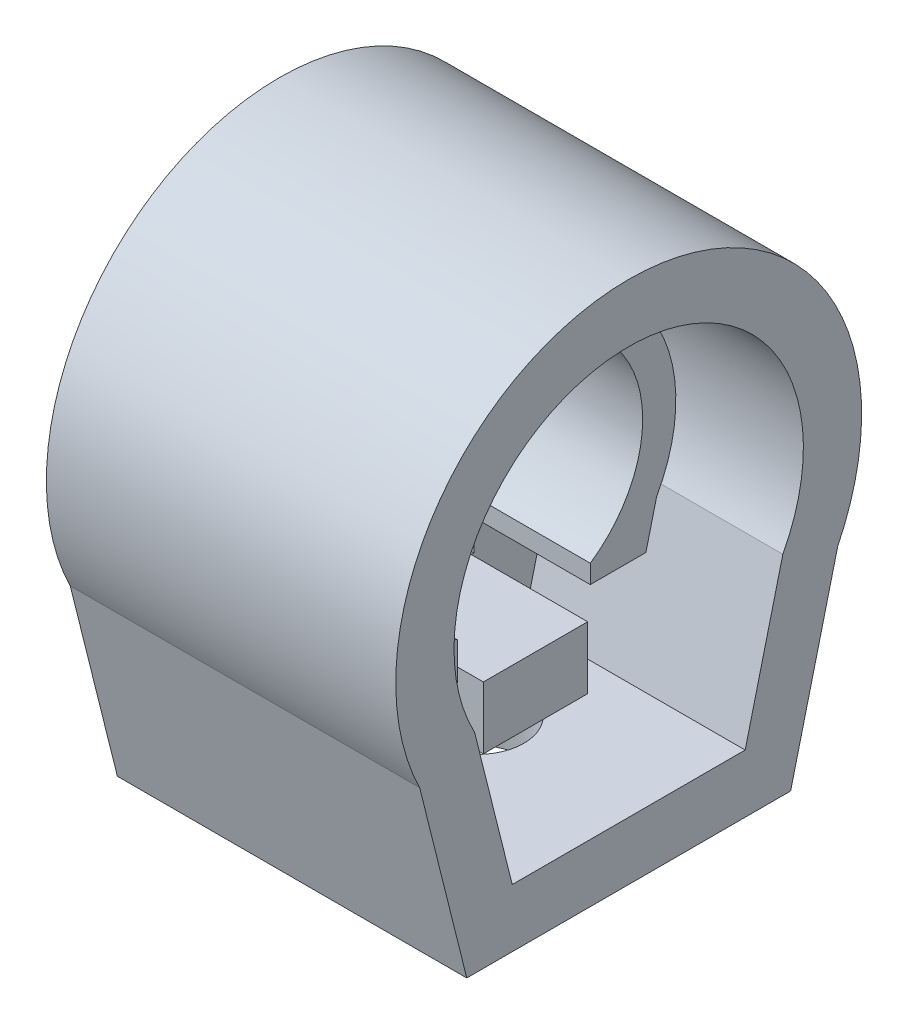
ISO-10303-21;
HEADER;
FILE_DESCRIPTION(('STEP AP214'),'2;1');
FILE_NAME('part.step','',(''),(''),'','','');
FILE_SCHEMA(('AUTOMOTIVE_DESIGN { 1 0 10303 214 1 1 1 1 }'));
ENDSEC;
DATA;
#1=APPLICATION_CONTEXT('core data for automotive mechanical design processes');
#2=APPLICATION_PROTOCOL_DEFINITION('international standard','automotive_design',2000,#1);
#3=PRODUCT_CONTEXT('',#1,'mechanical');
#4=PRODUCT('Part','Part','',(#3));
#5=PRODUCT_RELATED_PRODUCT_CATEGORY('part','',(#4));
#6=PRODUCT_DEFINITION_FORMATION('','',#4);
#7=PRODUCT_DEFINITION_CONTEXT('part definition',#1,'design');
#8=PRODUCT_DEFINITION('design','',#6,#7);
#9=PRODUCT_DEFINITION_SHAPE('','',#8);
#10=(LENGTH_UNIT() NAMED_UNIT(*) SI_UNIT(.MILLI.,.METRE.));
#11=(NAMED_UNIT(*) PLANE_ANGLE_UNIT() SI_UNIT($,.RADIAN.));
#12=(NAMED_UNIT(*) SI_UNIT($,.STERADIAN.) SOLID_ANGLE_UNIT());
#13=UNCERTAINTY_MEASURE_WITH_UNIT(LENGTH_MEASURE(1.E-05),#10,'distance_accuracy_value','');
#14=(GEOMETRIC_REPRESENTATION_CONTEXT(3) GLOBAL_UNCERTAINTY_ASSIGNED_CONTEXT((#13)) GLOBAL_UNIT_ASSIGNED_CONTEXT((#10,
#11,#12)) REPRESENTATION_CONTEXT('',''));
#15=CARTESIAN_POINT('',(0.,0.,0.));
#16=DIRECTION('',(0.,0.,1.));
#17=DIRECTION('',(1.,0.,0.));
#18=AXIS2_PLACEMENT_3D('',#15,#16,#17);
#19=CARTESIAN_POINT('',(53.5779066239683,32.7,20.7));
#20=DIRECTION('',(0.,1.,0.));
#21=DIRECTION('',(0.,0.,1.));
#22=AXIS2_PLACEMENT_3D('',#19,#20,#21);
#23=PLANE('',#22);
#24=DIRECTION('',(0.,0.,1.));
#25=VECTOR('',#24,1.);
#26=CARTESIAN_POINT('',(11.,32.7,15.));
#27=LINE('',#26,#25);
#28=CARTESIAN_POINT('',(11.,32.7,9.3));
#29=VERTEX_POINT('',#28);
#30=CARTESIAN_POINT('',(11.,32.7,20.7));
#31=VERTEX_POINT('',#30);
#32=EDGE_CURVE('E434',#29,#31,#27,.T.);
#33=ORIENTED_EDGE('',*,*,#32,.T.);
#34=DIRECTION('',(-1.,0.,0.));
#35=VECTOR('',#34,1.);
#36=CARTESIAN_POINT('',(53.5779066239683,32.7,20.7));
#37=LINE('',#36,#35);
#38=CARTESIAN_POINT('',(0.,32.7,20.7));
#39=VERTEX_POINT('',#38);
#40=EDGE_CURVE('E368',#31,#39,#37,.T.);
#41=ORIENTED_EDGE('',*,*,#40,.T.);
#42=DIRECTION('',(0.,0.,-1.));
#43=VECTOR('',#42,1.);
#44=CARTESIAN_POINT('',(0.,32.7,20.7));
#45=LINE('',#44,#43);
#46=CARTESIAN_POINT('',(0.,32.7,9.3));
#47=VERTEX_POINT('',#46);
#48=EDGE_CURVE('E357',#39,#47,#45,.T.);
#49=ORIENTED_EDGE('',*,*,#48,.T.);
#50=DIRECTION('',(-1.,0.,0.));
#51=VECTOR('',#50,1.);
#52=CARTESIAN_POINT('',(53.5779066239683,32.7,9.3));
#53=LINE('',#52,#51);
#54=EDGE_CURVE('E336',#29,#47,#53,.T.);
#55=ORIENTED_EDGE('',*,*,#54,.F.);
#56=EDGE_LOOP('',(#33,#41,#49,#55));
#57=FACE_BOUND('',#56,.T.);
#58=ADVANCED_FACE('F39',(#57),#23,.F.);
#59=CARTESIAN_POINT('',(21.,20.,15.));
#60=DIRECTION('',(1.,0.,0.));
#61=DIRECTION('',(0.,0.,-1.));
#62=AXIS2_PLACEMENT_3D('',#59,#60,#61);
#63=PLANE('',#62);
#64=DIRECTION('',(0.,-1.,0.));
#65=VECTOR('',#64,1.);
#66=CARTESIAN_POINT('',(21.,32.7,9.3));
#67=LINE('',#66,#65);
#68=CARTESIAN_POINT('',(21.,31.7393568818739,9.3));
#69=VERTEX_POINT('',#68);
#70=CARTESIAN_POINT('',(21.,28.458723307923,9.3));
#71=VERTEX_POINT('',#70);
#72=EDGE_CURVE('E395',#69,#71,#67,.T.);
#73=ORIENTED_EDGE('',*,*,#72,.T.);
#74=CARTESIAN_POINT('',(21.,20.,15.));
#75=DIRECTION('',(1.,0.,0.));
#76=DIRECTION('',(0.,0.,-1.));
#77=AXIS2_PLACEMENT_3D('',#74,#75,#76);
#78=CIRCLE('',#77,10.2);
#79=CARTESIAN_POINT('',(21.,11.541276692077,9.3));
#80=VERTEX_POINT('',#79);
#81=EDGE_CURVE('E390',#71,#80,#78,.F.);
#82=ORIENTED_EDGE('',*,*,#81,.T.);
#83=DIRECTION('',(0.,-1.,0.));
#84=VECTOR('',#83,1.);
#85=CARTESIAN_POINT('',(21.,7.3,9.3));
#86=LINE('',#85,#84);
#87=CARTESIAN_POINT('',(21.,9.95,9.3));
#88=VERTEX_POINT('',#87);
#89=EDGE_CURVE('E385',#80,#88,#86,.T.);
#90=ORIENTED_EDGE('',*,*,#89,.T.);
#91=DIRECTION('',(0.,0.,1.));
#92=VECTOR('',#91,1.);
#93=CARTESIAN_POINT('',(21.,9.95,9.52251399248861));
#94=LINE('',#93,#92);
#95=CARTESIAN_POINT('',(21.,9.95,4.52251399248861));
#96=VERTEX_POINT('',#95);
#97=EDGE_CURVE('E455',#96,#88,#94,.T.);
#98=ORIENTED_EDGE('',*,*,#97,.F.);
#99=DIRECTION('',(0.,0.970142500145332,-0.242535625036333));
#100=VECTOR('',#99,1.);
#101=CARTESIAN_POINT('',(21.,1.95000000000001,6.5225139924886));
#102=LINE('',#101,#100);
#103=CARTESIAN_POINT('',(21.,13.6552461306368,3.5962024598294));
#104=VERTEX_POINT('',#103);
#105=EDGE_CURVE('E518',#96,#104,#102,.T.);
#106=ORIENTED_EDGE('',*,*,#105,.T.);
#107=CARTESIAN_POINT('',(21.,20.,15.));
#108=DIRECTION('',(1.,0.,0.));
#109=DIRECTION('',(0.,0.,-1.));
#110=AXIS2_PLACEMENT_3D('',#107,#108,#109);
#111=CIRCLE('',#110,13.05);
#112=EDGE_CURVE('E522',#104,#69,#111,.T.);
#113=ORIENTED_EDGE('',*,*,#112,.T.);
#114=EDGE_LOOP('',(#73,#82,#90,#98,#106,#113));
#115=FACE_BOUND('',#114,.T.);
#116=ADVANCED_FACE('F608',(#115),#63,.T.);
#117=DIRECTION('',(0.,0.,1.));
#118=VECTOR('',#117,1.);
#119=CARTESIAN_POINT('',(21.,7.3,20.7));
#120=LINE('',#119,#118);
#121=CARTESIAN_POINT('',(21.,7.3,9.52251399248861));
#122=VERTEX_POINT('',#121);
#123=CARTESIAN_POINT('',(21.,7.3,18.4774860075114));
#124=VERTEX_POINT('',#123);
#125=EDGE_CURVE('E380',#122,#124,#120,.T.);
#126=ORIENTED_EDGE('',*,*,#125,.T.);
#127=DIRECTION('',(0.,1.,0.));
#128=VECTOR('',#127,1.);
#129=CARTESIAN_POINT('',(21.,6.94522765648909,18.4774860075114));
#130=LINE('',#129,#128);
#131=CARTESIAN_POINT('',(21.,1.95,18.4774860075114));
#132=VERTEX_POINT('',#131);
#133=EDGE_CURVE('E491',#132,#124,#130,.T.);
#134=ORIENTED_EDGE('',*,*,#133,.F.);
#135=DIRECTION('',(0.,0.,-1.));
#136=VECTOR('',#135,1.);
#137=CARTESIAN_POINT('',(21.,1.95000000000001,23.4774860075114));
#138=LINE('',#137,#136);
#139=CARTESIAN_POINT('',(21.,1.95,9.52251399248862));
#140=VERTEX_POINT('',#139);
#141=EDGE_CURVE('E513',#132,#140,#138,.T.);
#142=ORIENTED_EDGE('',*,*,#141,.T.);
#143=DIRECTION('',(0.,-1.,0.));
#144=VECTOR('',#143,1.);
#145=CARTESIAN_POINT('',(21.,1.95,9.52251399248862));
#146=LINE('',#145,#144);
#147=EDGE_CURVE('E451',#122,#140,#146,.T.);
#148=ORIENTED_EDGE('',*,*,#147,.F.);
#149=EDGE_LOOP('',(#126,#134,#142,#148));
#150=FACE_BOUND('',#149,.T.);
#151=ADVANCED_FACE('F632',(#150),#63,.T.);
#152=CARTESIAN_POINT('',(21.,20.,15.));
#153=DIRECTION('',(-1.,0.,0.));
#154=DIRECTION('',(0.,0.,1.));
#155=AXIS2_PLACEMENT_3D('',#152,#153,#154);
#156=CYLINDRICAL_SURFACE('',#155,13.05);
#157=CARTESIAN_POINT('',(11.,20.,15.));
#158=DIRECTION('',(1.,0.,0.));
#159=DIRECTION('',(0.,0.,-1.));
#160=AXIS2_PLACEMENT_3D('',#157,#158,#159);
#161=CIRCLE('',#160,13.05);
#162=CARTESIAN_POINT('',(11.,13.6552461306368,3.5962024598294));
#163=VERTEX_POINT('',#162);
#164=CARTESIAN_POINT('',(11.,31.7393568818739,9.3));
#165=VERTEX_POINT('',#164);
#166=EDGE_CURVE('E514',#163,#165,#161,.T.);
#167=ORIENTED_EDGE('',*,*,#166,.T.);
#168=DIRECTION('',(-1.,0.,0.));
#169=VECTOR('',#168,1.);
#170=CARTESIAN_POINT('',(21.,31.7393568818739,9.3));
#171=LINE('',#170,#169);
#172=EDGE_CURVE('E11',#165,#69,#171,.F.);
#173=ORIENTED_EDGE('',*,*,#172,.T.);
#174=ORIENTED_EDGE('',*,*,#112,.F.);
#175=DIRECTION('',(-1.,0.,0.));
#176=VECTOR('',#175,1.);
#177=CARTESIAN_POINT('',(21.,13.6552461306368,3.5962024598294));
#178=LINE('',#177,#176);
#179=EDGE_CURVE('E544',#104,#163,#178,.T.);
#180=ORIENTED_EDGE('',*,*,#179,.T.);
#181=EDGE_LOOP('',(#167,#173,#174,#180));
#182=FACE_BOUND('',#181,.T.);
#183=ADVANCED_FACE('F644',(#182),#156,.T.);
#184=CARTESIAN_POINT('',(11.,20.,15.));
#185=DIRECTION('',(1.,0.,0.));
#186=DIRECTION('',(0.,0.,-1.));
#187=AXIS2_PLACEMENT_3D('',#184,#185,#186);
#188=PLANE('',#187);
#189=ORIENTED_EDGE('',*,*,#32,.F.);
#190=DIRECTION('',(0.,1.,0.));
#191=VECTOR('',#190,1.);
#192=CARTESIAN_POINT('',(11.,20.,9.3));
#193=LINE('',#192,#191);
#194=EDGE_CURVE('E431',#165,#29,#193,.T.);
#195=ORIENTED_EDGE('',*,*,#194,.F.);
#196=ORIENTED_EDGE('',*,*,#166,.F.);
#197=DIRECTION('',(0.,0.970142500145332,-0.242535625036333));
#198=VECTOR('',#197,1.);
#199=CARTESIAN_POINT('',(11.,1.95000000000001,6.5225139924886));
#200=LINE('',#199,#198);
#201=CARTESIAN_POINT('',(11.,9.95,4.52251399248861));
#202=VERTEX_POINT('',#201);
#203=EDGE_CURVE('E534',#202,#163,#200,.T.);
#204=ORIENTED_EDGE('',*,*,#203,.F.);
#205=DIRECTION('',(0.,0.,1.));
#206=VECTOR('',#205,1.);
#207=CARTESIAN_POINT('',(11.,9.95,9.52251399248861));
#208=LINE('',#207,#206);
#209=CARTESIAN_POINT('',(11.,9.95,9.3));
#210=VERTEX_POINT('',#209);
#211=EDGE_CURVE('E446',#202,#210,#208,.T.);
#212=ORIENTED_EDGE('',*,*,#211,.T.);
#213=DIRECTION('',(0.,1.,0.));
#214=VECTOR('',#213,1.);
#215=CARTESIAN_POINT('',(11.,20.,9.3));
#216=LINE('',#215,#214);
#217=CARTESIAN_POINT('',(11.,7.3,9.3));
#218=VERTEX_POINT('',#217);
#219=EDGE_CURVE('E425',#218,#210,#216,.T.);
#220=ORIENTED_EDGE('',*,*,#219,.F.);
#221=DIRECTION('',(0.,0.,-1.));
#222=VECTOR('',#221,1.);
#223=CARTESIAN_POINT('',(11.,7.3,15.));
#224=LINE('',#223,#222);
#225=CARTESIAN_POINT('',(11.,7.3,9.52251399248861));
#226=VERTEX_POINT('',#225);
#227=EDGE_CURVE('E418',#226,#218,#224,.T.);
#228=ORIENTED_EDGE('',*,*,#227,.F.);
#229=DIRECTION('',(0.,-1.,0.));
#230=VECTOR('',#229,1.);
#231=CARTESIAN_POINT('',(11.,1.95,9.52251399248862));
#232=LINE('',#231,#230);
#233=CARTESIAN_POINT('',(11.,1.95,9.52251399248862));
#234=VERTEX_POINT('',#233);
#235=EDGE_CURVE('E450',#226,#234,#232,.T.);
#236=ORIENTED_EDGE('',*,*,#235,.T.);
#237=DIRECTION('',(0.,0.,-1.));
#238=VECTOR('',#237,1.);
#239=CARTESIAN_POINT('',(11.,1.95000000000001,23.4774860075114));
#240=LINE('',#239,#238);
#241=CARTESIAN_POINT('',(11.,1.95,18.4774860075114));
#242=VERTEX_POINT('',#241);
#243=EDGE_CURVE('E530',#242,#234,#240,.T.);
#244=ORIENTED_EDGE('',*,*,#243,.F.);
#245=DIRECTION('',(0.,1.,0.));
#246=VECTOR('',#245,1.);
#247=CARTESIAN_POINT('',(11.,1.95,18.4774860075114));
#248=LINE('',#247,#246);
#249=CARTESIAN_POINT('',(11.,7.3,18.4774860075114));
#250=VERTEX_POINT('',#249);
#251=EDGE_CURVE('E477',#242,#250,#248,.T.);
#252=ORIENTED_EDGE('',*,*,#251,.T.);
#253=CARTESIAN_POINT('',(11.,7.3,20.7));
#254=VERTEX_POINT('',#253);
#255=EDGE_CURVE('E63',#254,#250,#224,.T.);
#256=ORIENTED_EDGE('',*,*,#255,.F.);
#257=DIRECTION('',(0.,-1.,0.));
#258=VECTOR('',#257,1.);
#259=CARTESIAN_POINT('',(11.,20.,20.7));
#260=LINE('',#259,#258);
#261=CARTESIAN_POINT('',(11.,8.31625060179738,20.7));
#262=VERTEX_POINT('',#261);
#263=EDGE_CURVE('E422',#262,#254,#260,.T.);
#264=ORIENTED_EDGE('',*,*,#263,.F.);
#265=CARTESIAN_POINT('',(11.,20.,15.));
#266=DIRECTION('',(-1.,0.,0.));
#267=DIRECTION('',(0.,0.,-1.));
#268=AXIS2_PLACEMENT_3D('',#265,#266,#267);
#269=CIRCLE('',#268,13.);
#270=CARTESIAN_POINT('',(11.,10.1302766431731,23.4610023554958));
#271=VERTEX_POINT('',#270);
#272=EDGE_CURVE('E481',#262,#271,#269,.T.);
#273=ORIENTED_EDGE('',*,*,#272,.T.);
#274=DIRECTION('',(0.,-0.970142500145331,-0.242535625036338));
#275=VECTOR('',#274,1.);
#276=CARTESIAN_POINT('',(11.,9.2545548925994,23.2420719178524));
#277=LINE('',#276,#275);
#278=CARTESIAN_POINT('',(11.,3.95,21.9159331947026));
#279=VERTEX_POINT('',#278);
#280=EDGE_CURVE('E469',#271,#279,#277,.T.);
#281=ORIENTED_EDGE('',*,*,#280,.T.);
#282=DIRECTION('',(0.,0.,1.));
#283=VECTOR('',#282,1.);
#284=CARTESIAN_POINT('',(11.,3.95,21.9159331947026));
#285=LINE('',#284,#283);
#286=CARTESIAN_POINT('',(11.,3.95,23.9774860075114));
#287=VERTEX_POINT('',#286);
#288=EDGE_CURVE('E472',#279,#287,#285,.T.);
#289=ORIENTED_EDGE('',*,*,#288,.T.);
#290=DIRECTION('',(0.,-0.970142500145332,-0.242535625036334));
#291=VECTOR('',#290,1.);
#292=CARTESIAN_POINT('',(11.,13.6552461306369,26.4037975401706));
#293=LINE('',#292,#291);
#294=CARTESIAN_POINT('',(11.,13.6552461306369,26.4037975401706));
#295=VERTEX_POINT('',#294);
#296=EDGE_CURVE('E466',#295,#287,#293,.T.);
#297=ORIENTED_EDGE('',*,*,#296,.F.);
#298=CARTESIAN_POINT('',(11.,31.7393568818739,20.7));
#299=VERTEX_POINT('',#298);
#300=EDGE_CURVE('E537',#299,#295,#161,.T.);
#301=ORIENTED_EDGE('',*,*,#300,.F.);
#302=DIRECTION('',(0.,-1.,0.));
#303=VECTOR('',#302,1.);
#304=CARTESIAN_POINT('',(11.,20.,20.7));
#305=LINE('',#304,#303);
#306=EDGE_CURVE('E428',#31,#299,#305,.T.);
#307=ORIENTED_EDGE('',*,*,#306,.F.);
#308=EDGE_LOOP('',(#189,#195,#196,#204,#212,#220,#228,#236,#244,#252,#256,#264,#273,#281,#289,
#297,#301,#307));
#309=FACE_BOUND('',#308,.T.);
#310=DIRECTION('',(0.,0.,-1.));
#311=VECTOR('',#310,1.);
#312=CARTESIAN_POINT('',(11.,0.,24.2192235935956));
#313=LINE('',#312,#311);
#314=CARTESIAN_POINT('',(11.,0.,25.));
#315=VERTEX_POINT('',#314);
#316=CARTESIAN_POINT('',(11.,0.,4.99999999999999));
#317=VERTEX_POINT('',#316);
#318=EDGE_CURVE('E548',#315,#317,#313,.T.);
#319=ORIENTED_EDGE('',*,*,#318,.T.);
#320=DIRECTION('',(0.,0.970142500145332,-0.242535625036333));
#321=VECTOR('',#320,1.);
#322=CARTESIAN_POINT('',(11.,0.757464374963679,4.81063390625908));
#323=LINE('',#322,#321);
#324=CARTESIAN_POINT('',(11.,12.9411764705883,1.76470588235293));
#325=VERTEX_POINT('',#324);
#326=EDGE_CURVE('E247',#317,#325,#323,.T.);
#327=ORIENTED_EDGE('',*,*,#326,.T.);
#328=CARTESIAN_POINT('',(11.,20.,15.));
#329=DIRECTION('',(1.,0.,0.));
#330=DIRECTION('',(0.,0.,-1.));
#331=AXIS2_PLACEMENT_3D('',#328,#329,#330);
#332=CIRCLE('',#331,15.);
#333=CARTESIAN_POINT('',(11.,12.9411764705883,28.2352941176471));
#334=VERTEX_POINT('',#333);
#335=EDGE_CURVE('E553',#325,#334,#332,.T.);
#336=ORIENTED_EDGE('',*,*,#335,.T.);
#337=DIRECTION('',(0.,-0.970142500145332,-0.242535625036334));
#338=VECTOR('',#337,1.);
#339=CARTESIAN_POINT('',(11.,12.9411764705883,28.2352941176471));
#340=LINE('',#339,#338);
#341=EDGE_CURVE('E557',#334,#315,#340,.T.);
#342=ORIENTED_EDGE('',*,*,#341,.T.);
#343=EDGE_LOOP('',(#319,#327,#336,#342));
#344=FACE_BOUND('',#343,.T.);
#345=ADVANCED_FACE('F583',(#309,#344),#188,.T.);
#346=CARTESIAN_POINT('',(0.,20.,15.));
#347=DIRECTION('',(1.,0.,0.));
#348=DIRECTION('',(0.,0.,-1.));
#349=AXIS2_PLACEMENT_3D('',#346,#347,#348);
#350=PLANE('',#349);
#351=DIRECTION('',(0.,-1.,0.));
#352=VECTOR('',#351,1.);
#353=CARTESIAN_POINT('',(0.,32.7,9.3));
#354=LINE('',#353,#352);
#355=CARTESIAN_POINT('',(0.,28.458723307923,9.3));
#356=VERTEX_POINT('',#355);
#357=EDGE_CURVE('E353',#47,#356,#354,.T.);
#358=ORIENTED_EDGE('',*,*,#357,.F.);
#359=ORIENTED_EDGE('',*,*,#48,.F.);
#360=DIRECTION('',(0.,1.,0.));
#361=VECTOR('',#360,1.);
#362=CARTESIAN_POINT('',(0.,32.7,20.7));
#363=LINE('',#362,#361);
#364=CARTESIAN_POINT('',(0.,28.458723307923,20.7));
#365=VERTEX_POINT('',#364);
#366=EDGE_CURVE('E325',#365,#39,#363,.T.);
#367=ORIENTED_EDGE('',*,*,#366,.F.);
#368=CARTESIAN_POINT('',(0.,20.,15.));
#369=DIRECTION('',(-1.,0.,0.));
#370=DIRECTION('',(0.,0.,1.));
#371=AXIS2_PLACEMENT_3D('',#368,#369,#370);
#372=CIRCLE('',#371,10.2);
#373=CARTESIAN_POINT('',(0.,11.541276692077,20.7));
#374=VERTEX_POINT('',#373);
#375=EDGE_CURVE('E55',#374,#365,#372,.T.);
#376=ORIENTED_EDGE('',*,*,#375,.F.);
#377=DIRECTION('',(0.,1.,0.));
#378=VECTOR('',#377,1.);
#379=CARTESIAN_POINT('',(0.,7.3,20.7));
#380=LINE('',#379,#378);
#381=CARTESIAN_POINT('',(0.,7.3,20.7));
#382=VERTEX_POINT('',#381);
#383=EDGE_CURVE('E337',#382,#374,#380,.T.);
#384=ORIENTED_EDGE('',*,*,#383,.F.);
#385=DIRECTION('',(0.,0.,1.));
#386=VECTOR('',#385,1.);
#387=CARTESIAN_POINT('',(0.,7.3,20.7));
#388=LINE('',#387,#386);
#389=CARTESIAN_POINT('',(0.,7.3,9.3));
#390=VERTEX_POINT('',#389);
#391=EDGE_CURVE('E341',#390,#382,#388,.T.);
#392=ORIENTED_EDGE('',*,*,#391,.F.);
#393=DIRECTION('',(0.,-1.,0.));
#394=VECTOR('',#393,1.);
#395=CARTESIAN_POINT('',(0.,7.3,9.3));
#396=LINE('',#395,#394);
#397=CARTESIAN_POINT('',(0.,11.541276692077,9.3));
#398=VERTEX_POINT('',#397);
#399=EDGE_CURVE('E345',#398,#390,#396,.T.);
#400=ORIENTED_EDGE('',*,*,#399,.F.);
#401=CARTESIAN_POINT('',(0.,20.,15.));
#402=DIRECTION('',(-1.,0.,0.));
#403=DIRECTION('',(0.,0.,1.));
#404=AXIS2_PLACEMENT_3D('',#401,#402,#403);
#405=CIRCLE('',#404,10.2);
#406=EDGE_CURVE('E349',#356,#398,#405,.T.);
#407=ORIENTED_EDGE('',*,*,#406,.F.);
#408=EDGE_LOOP('',(#358,#359,#367,#376,#384,#392,#400,#407));
#409=FACE_BOUND('',#408,.T.);
#410=DIRECTION('',(0.,-0.970142500145332,0.242535625036333));
#411=VECTOR('',#410,1.);
#412=CARTESIAN_POINT('',(0.,11.1747833848056,-2.94757787822349));
#413=LINE('',#412,#411);
#414=CARTESIAN_POINT('',(0.,11.1747833848056,-2.94757787822348));
#415=VERTEX_POINT('',#414);
#416=CARTESIAN_POINT('',(0.,-4.99999999999999,1.09611796797791));
#417=VERTEX_POINT('',#416);
#418=EDGE_CURVE('E283',#415,#417,#413,.T.);
#419=ORIENTED_EDGE('',*,*,#418,.T.);
#420=DIRECTION('',(0.,0.,1.));
#421=VECTOR('',#420,1.);
#422=CARTESIAN_POINT('',(0.,-4.99999999999999,1.09611796797791));
#423=LINE('',#422,#421);
#424=CARTESIAN_POINT('',(0.,-4.99999999999999,28.9038820320221));
#425=VERTEX_POINT('',#424);
#426=EDGE_CURVE('E311',#417,#425,#423,.T.);
#427=ORIENTED_EDGE('',*,*,#426,.T.);
#428=DIRECTION('',(0.,0.970142500145332,0.242535625036334));
#429=VECTOR('',#428,1.);
#430=CARTESIAN_POINT('',(0.,-4.99999999999999,28.9038820320221));
#431=LINE('',#430,#429);
#432=CARTESIAN_POINT('',(0.,11.1747833848057,32.9475778782235));
#433=VERTEX_POINT('',#432);
#434=EDGE_CURVE('E315',#425,#433,#431,.T.);
#435=ORIENTED_EDGE('',*,*,#434,.T.);
#436=CARTESIAN_POINT('',(0.,20.,15.));
#437=DIRECTION('',(-1.,0.,0.));
#438=DIRECTION('',(0.,0.,1.));
#439=AXIS2_PLACEMENT_3D('',#436,#437,#438);
#440=CIRCLE('',#439,20.);
#441=EDGE_CURVE('E295',#433,#415,#440,.T.);
#442=ORIENTED_EDGE('',*,*,#441,.T.);
#443=EDGE_LOOP('',(#419,#427,#435,#442));
#444=FACE_BOUND('',#443,.T.);
#445=ADVANCED_FACE('F41',(#409,#444),#350,.F.);
#446=DIRECTION('',(0.,1.,0.));
#447=VECTOR('',#446,1.);
#448=CARTESIAN_POINT('',(21.,7.3,20.7));
#449=LINE('',#448,#447);
#450=CARTESIAN_POINT('',(21.,8.31625060179738,20.7));
#451=VERTEX_POINT('',#450);
#452=CARTESIAN_POINT('',(21.,11.541276692077,20.7));
#453=VERTEX_POINT('',#452);
#454=EDGE_CURVE('E375',#451,#453,#449,.T.);
#455=ORIENTED_EDGE('',*,*,#454,.T.);
#456=CARTESIAN_POINT('',(21.,20.,15.));
#457=DIRECTION('',(1.,0.,0.));
#458=DIRECTION('',(0.,0.,-1.));
#459=AXIS2_PLACEMENT_3D('',#456,#457,#458);
#460=CIRCLE('',#459,10.2);
#461=CARTESIAN_POINT('',(21.,28.458723307923,20.7));
#462=VERTEX_POINT('',#461);
#463=EDGE_CURVE('E370',#453,#462,#460,.F.);
#464=ORIENTED_EDGE('',*,*,#463,.T.);
#465=DIRECTION('',(0.,1.,0.));
#466=VECTOR('',#465,1.);
#467=CARTESIAN_POINT('',(21.,32.7,20.7));
#468=LINE('',#467,#466);
#469=CARTESIAN_POINT('',(21.,31.7393568818739,20.7));
#470=VERTEX_POINT('',#469);
#471=EDGE_CURVE('E364',#462,#470,#468,.T.);
#472=ORIENTED_EDGE('',*,*,#471,.T.);
#473=CARTESIAN_POINT('',(21.,13.6552461306369,26.4037975401706));
#474=VERTEX_POINT('',#473);
#475=EDGE_CURVE('E521',#470,#474,#111,.T.);
#476=ORIENTED_EDGE('',*,*,#475,.T.);
#477=DIRECTION('',(0.,-0.970142500145332,-0.242535625036334));
#478=VECTOR('',#477,1.);
#479=CARTESIAN_POINT('',(21.,13.6552461306369,26.4037975401706));
#480=LINE('',#479,#478);
#481=CARTESIAN_POINT('',(21.,3.95,23.9774860075114));
#482=VERTEX_POINT('',#481);
#483=EDGE_CURVE('E509',#474,#482,#480,.T.);
#484=ORIENTED_EDGE('',*,*,#483,.T.);
#485=DIRECTION('',(0.,0.,1.));
#486=VECTOR('',#485,1.);
#487=CARTESIAN_POINT('',(21.,3.95,21.9159331947026));
#488=LINE('',#487,#486);
#489=CARTESIAN_POINT('',(21.,3.95,21.9159331947026));
#490=VERTEX_POINT('',#489);
#491=EDGE_CURVE('E488',#490,#482,#488,.T.);
#492=ORIENTED_EDGE('',*,*,#491,.F.);
#493=DIRECTION('',(0.,-0.970142500145332,-0.242535625036334));
#494=VECTOR('',#493,1.);
#495=CARTESIAN_POINT('',(21.,9.2545548925994,23.2420719178524));
#496=LINE('',#495,#494);
#497=CARTESIAN_POINT('',(21.,10.1302766431731,23.4610023554958));
#498=VERTEX_POINT('',#497);
#499=EDGE_CURVE('E442',#498,#490,#496,.T.);
#500=ORIENTED_EDGE('',*,*,#499,.F.);
#501=CARTESIAN_POINT('',(21.,20.,15.));
#502=DIRECTION('',(-1.,0.,0.));
#503=DIRECTION('',(0.,0.,-1.));
#504=AXIS2_PLACEMENT_3D('',#501,#502,#503);
#505=CIRCLE('',#504,13.);
#506=EDGE_CURVE('E473',#451,#498,#505,.T.);
#507=ORIENTED_EDGE('',*,*,#506,.F.);
#508=EDGE_LOOP('',(#455,#464,#472,#476,#484,#492,#500,#507));
#509=FACE_BOUND('',#508,.T.);
#510=ADVANCED_FACE('F653',(#509),#63,.T.);
#511=CARTESIAN_POINT('',(21.,13.6552461306369,26.4037975401706));
#512=DIRECTION('',(0.,0.242535625036334,-0.970142500145332));
#513=DIRECTION('',(0.,0.970142500145332,0.242535625036334));
#514=AXIS2_PLACEMENT_3D('',#511,#512,#513);
#515=PLANE('',#514);
#516=ORIENTED_EDGE('',*,*,#296,.T.);
#517=DIRECTION('',(1.,0.,0.));
#518=VECTOR('',#517,1.);
#519=CARTESIAN_POINT('',(11.,3.95,23.9774860075114));
#520=LINE('',#519,#518);
#521=EDGE_CURVE('E503',#287,#482,#520,.T.);
#522=ORIENTED_EDGE('',*,*,#521,.T.);
#523=ORIENTED_EDGE('',*,*,#483,.F.);
#524=DIRECTION('',(-1.,0.,0.));
#525=VECTOR('',#524,1.);
#526=CARTESIAN_POINT('',(21.,13.6552461306369,26.4037975401706));
#527=LINE('',#526,#525);
#528=EDGE_CURVE('E526',#474,#295,#527,.T.);
#529=ORIENTED_EDGE('',*,*,#528,.T.);
#530=EDGE_LOOP('',(#516,#522,#523,#529));
#531=FACE_BOUND('',#530,.T.);
#532=ADVANCED_FACE('F676',(#531),#515,.F.);
#533=CARTESIAN_POINT('',(21.,1.95000000000001,23.4774860075114));
#534=DIRECTION('',(0.,1.,0.));
#535=DIRECTION('',(0.,0.,1.));
#536=AXIS2_PLACEMENT_3D('',#533,#534,#535);
#537=PLANE('',#536);
#538=CARTESIAN_POINT('',(16.,1.95000000000001,14.));
#539=DIRECTION('',(0.,-1.,0.));
#540=DIRECTION('',(0.,0.,-1.));
#541=AXIS2_PLACEMENT_3D('',#538,#539,#540);
#542=CIRCLE('',#541,1.55);
#543=CARTESIAN_POINT('',(16.,1.95000000000001,12.45));
#544=VERTEX_POINT('',#543);
#545=EDGE_CURVE('E437',#544,#544,#542,.T.);
#546=ORIENTED_EDGE('',*,*,#545,.F.);
#547=EDGE_LOOP('',(#546));
#548=FACE_BOUND('',#547,.T.);
#549=ORIENTED_EDGE('',*,*,#243,.T.);
#550=DIRECTION('',(1.,0.,0.));
#551=VECTOR('',#550,1.);
#552=CARTESIAN_POINT('',(11.,1.95,9.52251399248862));
#553=LINE('',#552,#551);
#554=EDGE_CURVE('E462',#234,#140,#553,.T.);
#555=ORIENTED_EDGE('',*,*,#554,.T.);
#556=ORIENTED_EDGE('',*,*,#141,.F.);
#557=DIRECTION('',(1.,0.,0.));
#558=VECTOR('',#557,1.);
#559=CARTESIAN_POINT('',(11.,1.95,18.4774860075114));
#560=LINE('',#559,#558);
#561=EDGE_CURVE('E500',#242,#132,#560,.T.);
#562=ORIENTED_EDGE('',*,*,#561,.F.);
#563=EDGE_LOOP('',(#549,#555,#556,#562));
#564=FACE_BOUND('',#563,.T.);
#565=ADVANCED_FACE('F628',(#548,#564),#537,.F.);
#566=CARTESIAN_POINT('',(21.,1.95000000000001,6.5225139924886));
#567=DIRECTION('',(0.,0.242535625036333,0.970142500145332));
#568=DIRECTION('',(0.,-0.970142500145332,0.242535625036333));
#569=AXIS2_PLACEMENT_3D('',#566,#567,#568);
#570=PLANE('',#569);
#571=ORIENTED_EDGE('',*,*,#105,.F.);
#572=DIRECTION('',(1.,0.,0.));
#573=VECTOR('',#572,1.);
#574=CARTESIAN_POINT('',(11.,9.95,4.52251399248861));
#575=LINE('',#574,#573);
#576=EDGE_CURVE('E454',#202,#96,#575,.T.);
#577=ORIENTED_EDGE('',*,*,#576,.F.);
#578=ORIENTED_EDGE('',*,*,#203,.T.);
#579=ORIENTED_EDGE('',*,*,#179,.F.);
#580=EDGE_LOOP('',(#571,#577,#578,#579));
#581=FACE_BOUND('',#580,.T.);
#582=ADVANCED_FACE('F604',(#581),#570,.F.);
#583=ORIENTED_EDGE('',*,*,#475,.F.);
#584=DIRECTION('',(-1.,0.,0.));
#585=VECTOR('',#584,1.);
#586=CARTESIAN_POINT('',(21.,31.7393568818739,20.7));
#587=LINE('',#586,#585);
#588=EDGE_CURVE('E48',#470,#299,#587,.T.);
#589=ORIENTED_EDGE('',*,*,#588,.T.);
#590=ORIENTED_EDGE('',*,*,#300,.T.);
#591=ORIENTED_EDGE('',*,*,#528,.F.);
#592=EDGE_LOOP('',(#583,#589,#590,#591));
#593=FACE_BOUND('',#592,.T.);
#594=ADVANCED_FACE('F576',(#593),#156,.T.);
#595=CARTESIAN_POINT('',(11.,1.95,9.52251399248862));
#596=DIRECTION('',(0.,0.,1.));
#597=DIRECTION('',(0.,-1.,0.));
#598=AXIS2_PLACEMENT_3D('',#595,#596,#597);
#599=PLANE('',#598);
#600=ORIENTED_EDGE('',*,*,#235,.F.);
#601=DIRECTION('',(1.,0.,0.));
#602=VECTOR('',#601,1.);
#603=CARTESIAN_POINT('',(11.,7.3,9.52251399248861));
#604=LINE('',#603,#602);
#605=EDGE_CURVE('E417',#226,#122,#604,.T.);
#606=ORIENTED_EDGE('',*,*,#605,.T.);
#607=ORIENTED_EDGE('',*,*,#147,.T.);
#608=ORIENTED_EDGE('',*,*,#554,.F.);
#609=EDGE_LOOP('',(#600,#606,#607,#608));
#610=FACE_BOUND('',#609,.T.);
#611=ADVANCED_FACE('F634',(#610),#599,.F.);
#612=CARTESIAN_POINT('',(11.,9.95,9.52251399248861));
#613=DIRECTION('',(0.,1.,0.));
#614=DIRECTION('',(0.,0.,1.));
#615=AXIS2_PLACEMENT_3D('',#612,#613,#614);
#616=PLANE('',#615);
#617=ORIENTED_EDGE('',*,*,#97,.T.);
#618=DIRECTION('',(-1.,0.,0.));
#619=VECTOR('',#618,1.);
#620=CARTESIAN_POINT('',(11.,9.95,9.3));
#621=LINE('',#620,#619);
#622=EDGE_CURVE('E568',#88,#210,#621,.T.);
#623=ORIENTED_EDGE('',*,*,#622,.T.);
#624=ORIENTED_EDGE('',*,*,#211,.F.);
#625=ORIENTED_EDGE('',*,*,#576,.T.);
#626=EDGE_LOOP('',(#617,#623,#624,#625));
#627=FACE_BOUND('',#626,.T.);
#628=ADVANCED_FACE('F600',(#627),#616,.F.);
#629=CARTESIAN_POINT('',(11.,20.,15.));
#630=DIRECTION('',(1.,0.,0.));
#631=DIRECTION('',(0.,0.,-1.));
#632=AXIS2_PLACEMENT_3D('',#629,#630,#631);
#633=CYLINDRICAL_SURFACE('',#632,13.);
#634=ORIENTED_EDGE('',*,*,#272,.F.);
#635=DIRECTION('',(1.,0.,0.));
#636=VECTOR('',#635,1.);
#637=CARTESIAN_POINT('',(11.,8.31625060179738,20.7));
#638=LINE('',#637,#636);
#639=EDGE_CURVE('E564',#262,#451,#638,.T.);
#640=ORIENTED_EDGE('',*,*,#639,.T.);
#641=ORIENTED_EDGE('',*,*,#506,.T.);
#642=DIRECTION('',(1.,0.,0.));
#643=VECTOR('',#642,1.);
#644=CARTESIAN_POINT('',(11.,10.1302766431731,23.4610023554958));
#645=LINE('',#644,#643);
#646=EDGE_CURVE('E459',#271,#498,#645,.T.);
#647=ORIENTED_EDGE('',*,*,#646,.F.);
#648=EDGE_LOOP('',(#634,#640,#641,#647));
#649=FACE_BOUND('',#648,.T.);
#650=ADVANCED_FACE('F641',(#649),#633,.T.);
#651=CARTESIAN_POINT('',(11.,6.94522765648909,18.4774860075114));
#652=DIRECTION('',(0.,0.,-1.));
#653=DIRECTION('',(-1.,0.,0.));
#654=AXIS2_PLACEMENT_3D('',#651,#652,#653);
#655=PLANE('',#654);
#656=ORIENTED_EDGE('',*,*,#133,.T.);
#657=DIRECTION('',(-1.,0.,0.));
#658=VECTOR('',#657,1.);
#659=CARTESIAN_POINT('',(11.,7.3,18.4774860075114));
#660=LINE('',#659,#658);
#661=EDGE_CURVE('E561',#124,#250,#660,.T.);
#662=ORIENTED_EDGE('',*,*,#661,.T.);
#663=ORIENTED_EDGE('',*,*,#251,.F.);
#664=ORIENTED_EDGE('',*,*,#561,.T.);
#665=EDGE_LOOP('',(#656,#662,#663,#664));
#666=FACE_BOUND('',#665,.T.);
#667=ADVANCED_FACE('F624',(#666),#655,.F.);
#668=CARTESIAN_POINT('',(11.,3.95,21.9159331947026));
#669=DIRECTION('',(0.,1.,0.));
#670=DIRECTION('',(0.,0.,1.));
#671=AXIS2_PLACEMENT_3D('',#668,#669,#670);
#672=PLANE('',#671);
#673=ORIENTED_EDGE('',*,*,#491,.T.);
#674=ORIENTED_EDGE('',*,*,#521,.F.);
#675=ORIENTED_EDGE('',*,*,#288,.F.);
#676=DIRECTION('',(1.,0.,0.));
#677=VECTOR('',#676,1.);
#678=CARTESIAN_POINT('',(11.,3.95,21.9159331947026));
#679=LINE('',#678,#677);
#680=EDGE_CURVE('E484',#279,#490,#679,.T.);
#681=ORIENTED_EDGE('',*,*,#680,.T.);
#682=EDGE_LOOP('',(#673,#674,#675,#681));
#683=FACE_BOUND('',#682,.T.);
#684=ADVANCED_FACE('F668',(#683),#672,.F.);
#685=CARTESIAN_POINT('',(11.,9.2545548925994,23.2420719178524));
#686=DIRECTION('',(0.,-0.242535625036334,0.970142500145332));
#687=DIRECTION('',(0.,-0.970142500145332,-0.242535625036334));
#688=AXIS2_PLACEMENT_3D('',#685,#686,#687);
#689=PLANE('',#688);
#690=ORIENTED_EDGE('',*,*,#499,.T.);
#691=ORIENTED_EDGE('',*,*,#680,.F.);
#692=ORIENTED_EDGE('',*,*,#280,.F.);
#693=ORIENTED_EDGE('',*,*,#646,.T.);
#694=EDGE_LOOP('',(#690,#691,#692,#693));
#695=FACE_BOUND('',#694,.T.);
#696=ADVANCED_FACE('F663',(#695),#689,.F.);
#697=CARTESIAN_POINT('',(16.,6.95000000000001,14.));
#698=DIRECTION('',(0.,-1.,0.));
#699=DIRECTION('',(0.,0.,-1.));
#700=AXIS2_PLACEMENT_3D('',#697,#698,#699);
#701=CYLINDRICAL_SURFACE('',#700,1.55);
#702=CARTESIAN_POINT('',(16.,6.95000000000001,14.));
#703=DIRECTION('',(0.,-1.,0.));
#704=DIRECTION('',(0.,0.,-1.));
#705=AXIS2_PLACEMENT_3D('',#702,#703,#704);
#706=CIRCLE('',#705,1.55);
#707=CARTESIAN_POINT('',(16.,6.95000000000001,12.45));
#708=VERTEX_POINT('',#707);
#709=EDGE_CURVE('E438',#708,#708,#706,.T.);
#710=ORIENTED_EDGE('',*,*,#709,.F.);
#711=EDGE_LOOP('',(#710));
#712=FACE_BOUND('',#711,.T.);
#713=ORIENTED_EDGE('',*,*,#545,.T.);
#714=EDGE_LOOP('',(#713));
#715=FACE_BOUND('',#714,.T.);
#716=ADVANCED_FACE('F660',(#712,#715),#701,.F.);
#717=CARTESIAN_POINT('',(16.,6.95000000000001,14.));
#718=DIRECTION('',(0.,-1.,0.));
#719=DIRECTION('',(0.,0.,-1.));
#720=AXIS2_PLACEMENT_3D('',#717,#718,#719);
#721=PLANE('',#720);
#722=ORIENTED_EDGE('',*,*,#709,.T.);
#723=EDGE_LOOP('',(#722));
#724=FACE_BOUND('',#723,.T.);
#725=ADVANCED_FACE('F658',(#724),#721,.T.);
#726=CARTESIAN_POINT('',(53.5779066239683,32.7,9.3));
#727=DIRECTION('',(0.,0.,-1.));
#728=DIRECTION('',(-1.,0.,0.));
#729=AXIS2_PLACEMENT_3D('',#726,#727,#728);
#730=PLANE('',#729);
#731=ORIENTED_EDGE('',*,*,#194,.T.);
#732=ORIENTED_EDGE('',*,*,#54,.T.);
#733=ORIENTED_EDGE('',*,*,#357,.T.);
#734=DIRECTION('',(-1.,0.,0.));
#735=VECTOR('',#734,1.);
#736=CARTESIAN_POINT('',(53.5779066239683,28.458723307923,9.3));
#737=LINE('',#736,#735);
#738=EDGE_CURVE('E394',#71,#356,#737,.T.);
#739=ORIENTED_EDGE('',*,*,#738,.F.);
#740=ORIENTED_EDGE('',*,*,#72,.F.);
#741=ORIENTED_EDGE('',*,*,#172,.F.);
#742=EDGE_LOOP('',(#731,#732,#733,#739,#740,#741));
#743=FACE_BOUND('',#742,.T.);
#744=ADVANCED_FACE('F656',(#743),#730,.F.);
#745=CARTESIAN_POINT('',(53.5779066239683,20.,15.));
#746=DIRECTION('',(-1.,0.,0.));
#747=DIRECTION('',(0.,0.,1.));
#748=AXIS2_PLACEMENT_3D('',#745,#746,#747);
#749=CYLINDRICAL_SURFACE('',#748,10.2);
#750=ORIENTED_EDGE('',*,*,#738,.T.);
#751=ORIENTED_EDGE('',*,*,#406,.T.);
#752=DIRECTION('',(-1.,0.,0.));
#753=VECTOR('',#752,1.);
#754=CARTESIAN_POINT('',(53.5779066239683,11.541276692077,9.3));
#755=LINE('',#754,#753);
#756=EDGE_CURVE('E389',#80,#398,#755,.T.);
#757=ORIENTED_EDGE('',*,*,#756,.F.);
#758=ORIENTED_EDGE('',*,*,#81,.F.);
#759=EDGE_LOOP('',(#750,#751,#757,#758));
#760=FACE_BOUND('',#759,.T.);
#761=ADVANCED_FACE('F611',(#760),#749,.F.);
#762=CARTESIAN_POINT('',(53.5779066239683,7.3,9.3));
#763=DIRECTION('',(0.,0.,-1.));
#764=DIRECTION('',(-1.,0.,0.));
#765=AXIS2_PLACEMENT_3D('',#762,#763,#764);
#766=PLANE('',#765);
#767=ORIENTED_EDGE('',*,*,#219,.T.);
#768=ORIENTED_EDGE('',*,*,#622,.F.);
#769=ORIENTED_EDGE('',*,*,#89,.F.);
#770=ORIENTED_EDGE('',*,*,#756,.T.);
#771=ORIENTED_EDGE('',*,*,#399,.T.);
#772=DIRECTION('',(-1.,0.,0.));
#773=VECTOR('',#772,1.);
#774=CARTESIAN_POINT('',(53.5779066239683,7.3,9.3));
#775=LINE('',#774,#773);
#776=EDGE_CURVE('E384',#218,#390,#775,.T.);
#777=ORIENTED_EDGE('',*,*,#776,.F.);
#778=EDGE_LOOP('',(#767,#768,#769,#770,#771,#777));
#779=FACE_BOUND('',#778,.T.);
#780=ADVANCED_FACE('F593',(#779),#766,.F.);
#781=CARTESIAN_POINT('',(53.5779066239683,7.3,20.7));
#782=DIRECTION('',(0.,-1.,0.));
#783=DIRECTION('',(0.,0.,-1.));
#784=AXIS2_PLACEMENT_3D('',#781,#782,#783);
#785=PLANE('',#784);
#786=ORIENTED_EDGE('',*,*,#227,.T.);
#787=ORIENTED_EDGE('',*,*,#776,.T.);
#788=ORIENTED_EDGE('',*,*,#391,.T.);
#789=DIRECTION('',(-1.,0.,0.));
#790=VECTOR('',#789,1.);
#791=CARTESIAN_POINT('',(53.5779066239683,7.3,20.7));
#792=LINE('',#791,#790);
#793=EDGE_CURVE('E379',#254,#382,#792,.T.);
#794=ORIENTED_EDGE('',*,*,#793,.F.);
#795=ORIENTED_EDGE('',*,*,#255,.T.);
#796=ORIENTED_EDGE('',*,*,#661,.F.);
#797=ORIENTED_EDGE('',*,*,#125,.F.);
#798=ORIENTED_EDGE('',*,*,#605,.F.);
#799=EDGE_LOOP('',(#786,#787,#788,#794,#795,#796,#797,#798));
#800=FACE_BOUND('',#799,.T.);
#801=ADVANCED_FACE('F589',(#800),#785,.F.);
#802=CARTESIAN_POINT('',(53.5779066239683,7.3,20.7));
#803=DIRECTION('',(0.,0.,1.));
#804=DIRECTION('',(1.,0.,0.));
#805=AXIS2_PLACEMENT_3D('',#802,#803,#804);
#806=PLANE('',#805);
#807=ORIENTED_EDGE('',*,*,#263,.T.);
#808=ORIENTED_EDGE('',*,*,#793,.T.);
#809=ORIENTED_EDGE('',*,*,#383,.T.);
#810=DIRECTION('',(-1.,0.,0.));
#811=VECTOR('',#810,1.);
#812=CARTESIAN_POINT('',(53.5779066239683,11.541276692077,20.7));
#813=LINE('',#812,#811);
#814=EDGE_CURVE('E374',#453,#374,#813,.T.);
#815=ORIENTED_EDGE('',*,*,#814,.F.);
#816=ORIENTED_EDGE('',*,*,#454,.F.);
#817=ORIENTED_EDGE('',*,*,#639,.F.);
#818=EDGE_LOOP('',(#807,#808,#809,#815,#816,#817));
#819=FACE_BOUND('',#818,.T.);
#820=ADVANCED_FACE('F720',(#819),#806,.F.);
#821=CARTESIAN_POINT('',(53.5779066239683,20.,15.));
#822=DIRECTION('',(-1.,0.,0.));
#823=DIRECTION('',(0.,0.,1.));
#824=AXIS2_PLACEMENT_3D('',#821,#822,#823);
#825=CYLINDRICAL_SURFACE('',#824,10.2);
#826=ORIENTED_EDGE('',*,*,#814,.T.);
#827=ORIENTED_EDGE('',*,*,#375,.T.);
#828=DIRECTION('',(-1.,0.,0.));
#829=VECTOR('',#828,1.);
#830=CARTESIAN_POINT('',(53.5779066239683,28.458723307923,20.7));
#831=LINE('',#830,#829);
#832=EDGE_CURVE('E369',#462,#365,#831,.T.);
#833=ORIENTED_EDGE('',*,*,#832,.F.);
#834=ORIENTED_EDGE('',*,*,#463,.F.);
#835=EDGE_LOOP('',(#826,#827,#833,#834));
#836=FACE_BOUND('',#835,.T.);
#837=ADVANCED_FACE('F718',(#836),#825,.F.);
#838=CARTESIAN_POINT('',(53.5779066239683,32.7,20.7));
#839=DIRECTION('',(0.,0.,1.));
#840=DIRECTION('',(1.,0.,0.));
#841=AXIS2_PLACEMENT_3D('',#838,#839,#840);
#842=PLANE('',#841);
#843=ORIENTED_EDGE('',*,*,#306,.T.);
#844=ORIENTED_EDGE('',*,*,#588,.F.);
#845=ORIENTED_EDGE('',*,*,#471,.F.);
#846=ORIENTED_EDGE('',*,*,#832,.T.);
#847=ORIENTED_EDGE('',*,*,#366,.T.);
#848=ORIENTED_EDGE('',*,*,#40,.F.);
#849=EDGE_LOOP('',(#843,#844,#845,#846,#847,#848));
#850=FACE_BOUND('',#849,.T.);
#851=ADVANCED_FACE('F716',(#850),#842,.F.);
#852=CARTESIAN_POINT('',(30.,11.1747833848056,-2.94757787822349));
#853=DIRECTION('',(0.,-0.242535625036333,-0.970142500145332));
#854=DIRECTION('',(0.,0.970142500145332,-0.242535625036333));
#855=AXIS2_PLACEMENT_3D('',#852,#853,#854);
#856=PLANE('',#855);
#857=ORIENTED_EDGE('',*,*,#418,.F.);
#858=DIRECTION('',(-1.,0.,0.));
#859=VECTOR('',#858,1.);
#860=CARTESIAN_POINT('',(30.,11.1747833848056,-2.94757787822348));
#861=LINE('',#860,#859);
#862=CARTESIAN_POINT('',(30.,11.1747833848056,-2.94757787822348));
#863=VERTEX_POINT('',#862);
#864=EDGE_CURVE('E322',#863,#415,#861,.T.);
#865=ORIENTED_EDGE('',*,*,#864,.F.);
#866=DIRECTION('',(0.,-0.970142500145332,0.242535625036333));
#867=VECTOR('',#866,1.);
#868=CARTESIAN_POINT('',(30.,11.1747833848056,-2.94757787822349));
#869=LINE('',#868,#867);
#870=CARTESIAN_POINT('',(30.,-4.99999999999999,1.09611796797791));
#871=VERTEX_POINT('',#870);
#872=EDGE_CURVE('E290',#863,#871,#869,.T.);
#873=ORIENTED_EDGE('',*,*,#872,.T.);
#874=DIRECTION('',(-1.,0.,0.));
#875=VECTOR('',#874,1.);
#876=CARTESIAN_POINT('',(30.,-4.99999999999999,1.09611796797791));
#877=LINE('',#876,#875);
#878=EDGE_CURVE('E307',#871,#417,#877,.T.);
#879=ORIENTED_EDGE('',*,*,#878,.T.);
#880=EDGE_LOOP('',(#857,#865,#873,#879));
#881=FACE_BOUND('',#880,.T.);
#882=ADVANCED_FACE('F743',(#881),#856,.T.);
#883=CARTESIAN_POINT('',(30.,20.,15.));
#884=DIRECTION('',(-1.,0.,0.));
#885=DIRECTION('',(0.,0.,1.));
#886=AXIS2_PLACEMENT_3D('',#883,#884,#885);
#887=CYLINDRICAL_SURFACE('',#886,20.);
#888=ORIENTED_EDGE('',*,*,#441,.F.);
#889=DIRECTION('',(-1.,0.,0.));
#890=VECTOR('',#889,1.);
#891=CARTESIAN_POINT('',(30.,11.1747833848057,32.9475778782235));
#892=LINE('',#891,#890);
#893=CARTESIAN_POINT('',(30.,11.1747833848057,32.9475778782235));
#894=VERTEX_POINT('',#893);
#895=EDGE_CURVE('E326',#894,#433,#892,.T.);
#896=ORIENTED_EDGE('',*,*,#895,.F.);
#897=CARTESIAN_POINT('',(30.,20.,15.));
#898=DIRECTION('',(-1.,0.,0.));
#899=DIRECTION('',(0.,0.,1.));
#900=AXIS2_PLACEMENT_3D('',#897,#898,#899);
#901=CIRCLE('',#900,20.);
#902=EDGE_CURVE('E303',#894,#863,#901,.T.);
#903=ORIENTED_EDGE('',*,*,#902,.T.);
#904=ORIENTED_EDGE('',*,*,#864,.T.);
#905=EDGE_LOOP('',(#888,#896,#903,#904));
#906=FACE_BOUND('',#905,.T.);
#907=ADVANCED_FACE('F746',(#906),#887,.T.);
#908=CARTESIAN_POINT('',(30.,-4.99999999999999,28.9038820320221));
#909=DIRECTION('',(0.,-0.242535625036334,0.970142500145332));
#910=DIRECTION('',(0.,-0.970142500145332,-0.242535625036334));
#911=AXIS2_PLACEMENT_3D('',#908,#909,#910);
#912=PLANE('',#911);
#913=ORIENTED_EDGE('',*,*,#434,.F.);
#914=DIRECTION('',(-1.,0.,0.));
#915=VECTOR('',#914,1.);
#916=CARTESIAN_POINT('',(30.,-4.99999999999999,28.9038820320221));
#917=LINE('',#916,#915);
#918=CARTESIAN_POINT('',(30.,-4.99999999999999,28.9038820320221));
#919=VERTEX_POINT('',#918);
#920=EDGE_CURVE('E329',#919,#425,#917,.T.);
#921=ORIENTED_EDGE('',*,*,#920,.F.);
#922=DIRECTION('',(0.,0.970142500145332,0.242535625036334));
#923=VECTOR('',#922,1.);
#924=CARTESIAN_POINT('',(30.,-4.99999999999999,28.9038820320221));
#925=LINE('',#924,#923);
#926=EDGE_CURVE('E299',#919,#894,#925,.T.);
#927=ORIENTED_EDGE('',*,*,#926,.T.);
#928=ORIENTED_EDGE('',*,*,#895,.T.);
#929=EDGE_LOOP('',(#913,#921,#927,#928));
#930=FACE_BOUND('',#929,.T.);
#931=ADVANCED_FACE('F751',(#930),#912,.T.);
#932=CARTESIAN_POINT('',(30.,-4.99999999999999,1.09611796797791));
#933=DIRECTION('',(0.,-1.,0.));
#934=DIRECTION('',(0.,0.,-1.));
#935=AXIS2_PLACEMENT_3D('',#932,#933,#934);
#936=PLANE('',#935);
#937=CARTESIAN_POINT('',(16.,-4.99999999999999,14.));
#938=DIRECTION('',(0.,-1.,0.));
#939=DIRECTION('',(0.,0.,-1.));
#940=AXIS2_PLACEMENT_3D('',#937,#938,#939);
#941=CIRCLE('',#940,4.);
#942=CARTESIAN_POINT('',(16.,-4.99999999999999,10.));
#943=VERTEX_POINT('',#942);
#944=EDGE_CURVE('E268',#943,#943,#941,.T.);
#945=ORIENTED_EDGE('',*,*,#944,.F.);
#946=EDGE_LOOP('',(#945));
#947=FACE_BOUND('',#946,.T.);
#948=ORIENTED_EDGE('',*,*,#426,.F.);
#949=ORIENTED_EDGE('',*,*,#878,.F.);
#950=DIRECTION('',(0.,0.,1.));
#951=VECTOR('',#950,1.);
#952=CARTESIAN_POINT('',(30.,-4.99999999999999,1.09611796797791));
#953=LINE('',#952,#951);
#954=EDGE_CURVE('E294',#871,#919,#953,.T.);
#955=ORIENTED_EDGE('',*,*,#954,.T.);
#956=ORIENTED_EDGE('',*,*,#920,.T.);
#957=EDGE_LOOP('',(#948,#949,#955,#956));
#958=FACE_BOUND('',#957,.T.);
#959=ADVANCED_FACE('F748',(#947,#958),#936,.T.);
#960=CARTESIAN_POINT('',(30.,20.,15.));
#961=DIRECTION('',(-1.,0.,0.));
#962=DIRECTION('',(0.,0.,1.));
#963=AXIS2_PLACEMENT_3D('',#960,#961,#962);
#964=PLANE('',#963);
#965=CARTESIAN_POINT('',(30.,20.,15.));
#966=DIRECTION('',(-1.,0.,0.));
#967=DIRECTION('',(0.,0.,1.));
#968=AXIS2_PLACEMENT_3D('',#965,#966,#967);
#969=CIRCLE('',#968,15.);
#970=CARTESIAN_POINT('',(30.,12.9411764705883,28.2352941176471));
#971=VERTEX_POINT('',#970);
#972=CARTESIAN_POINT('',(30.,12.9411764705883,1.76470588235293));
#973=VERTEX_POINT('',#972);
#974=EDGE_CURVE('E252',#971,#973,#969,.T.);
#975=ORIENTED_EDGE('',*,*,#974,.T.);
#976=DIRECTION('',(0.,-0.970142500145332,0.242535625036333));
#977=VECTOR('',#976,1.);
#978=CARTESIAN_POINT('',(30.,12.9411764705883,1.76470588235293));
#979=LINE('',#978,#977);
#980=CARTESIAN_POINT('',(30.,0.,4.99999999999999));
#981=VERTEX_POINT('',#980);
#982=EDGE_CURVE('E244',#973,#981,#979,.T.);
#983=ORIENTED_EDGE('',*,*,#982,.T.);
#984=DIRECTION('',(0.,0.,1.));
#985=VECTOR('',#984,1.);
#986=CARTESIAN_POINT('',(30.,0.,4.99999999999999));
#987=LINE('',#986,#985);
#988=CARTESIAN_POINT('',(30.,0.,25.));
#989=VERTEX_POINT('',#988);
#990=EDGE_CURVE('E256',#981,#989,#987,.T.);
#991=ORIENTED_EDGE('',*,*,#990,.T.);
#992=DIRECTION('',(0.,0.970142500145332,0.242535625036334));
#993=VECTOR('',#992,1.);
#994=CARTESIAN_POINT('',(30.,0.,25.));
#995=LINE('',#994,#993);
#996=EDGE_CURVE('E262',#989,#971,#995,.T.);
#997=ORIENTED_EDGE('',*,*,#996,.T.);
#998=EDGE_LOOP('',(#975,#983,#991,#997));
#999=FACE_BOUND('',#998,.T.);
#1000=ORIENTED_EDGE('',*,*,#872,.F.);
#1001=ORIENTED_EDGE('',*,*,#902,.F.);
#1002=ORIENTED_EDGE('',*,*,#926,.F.);
#1003=ORIENTED_EDGE('',*,*,#954,.F.);
#1004=EDGE_LOOP('',(#1000,#1001,#1002,#1003));
#1005=FACE_BOUND('',#1004,.T.);
#1006=ADVANCED_FACE('F264',(#999,#1005),#964,.F.);
#1007=CARTESIAN_POINT('',(30.,12.9411764705883,1.76470588235293));
#1008=DIRECTION('',(0.,-0.242535625036333,-0.970142500145332));
#1009=DIRECTION('',(0.,0.970142500145332,-0.242535625036333));
#1010=AXIS2_PLACEMENT_3D('',#1007,#1008,#1009);
#1011=PLANE('',#1010);
#1012=ORIENTED_EDGE('',*,*,#326,.F.);
#1013=DIRECTION('',(-1.,0.,0.));
#1014=VECTOR('',#1013,1.);
#1015=CARTESIAN_POINT('',(30.,0.,4.99999999999999));
#1016=LINE('',#1015,#1014);
#1017=EDGE_CURVE('E239',#981,#317,#1016,.T.);
#1018=ORIENTED_EDGE('',*,*,#1017,.F.);
#1019=ORIENTED_EDGE('',*,*,#982,.F.);
#1020=DIRECTION('',(-1.,0.,0.));
#1021=VECTOR('',#1020,1.);
#1022=CARTESIAN_POINT('',(30.,12.9411764705883,1.76470588235293));
#1023=LINE('',#1022,#1021);
#1024=EDGE_CURVE('E280',#973,#325,#1023,.T.);
#1025=ORIENTED_EDGE('',*,*,#1024,.T.);
#1026=EDGE_LOOP('',(#1012,#1018,#1019,#1025));
#1027=FACE_BOUND('',#1026,.T.);
#1028=ADVANCED_FACE('F241',(#1027),#1011,.F.);
#1029=CARTESIAN_POINT('',(30.,20.,15.));
#1030=DIRECTION('',(-1.,0.,0.));
#1031=DIRECTION('',(0.,0.,1.));
#1032=AXIS2_PLACEMENT_3D('',#1029,#1030,#1031);
#1033=CYLINDRICAL_SURFACE('',#1032,15.);
#1034=ORIENTED_EDGE('',*,*,#335,.F.);
#1035=ORIENTED_EDGE('',*,*,#1024,.F.);
#1036=ORIENTED_EDGE('',*,*,#974,.F.);
#1037=DIRECTION('',(-1.,0.,0.));
#1038=VECTOR('',#1037,1.);
#1039=CARTESIAN_POINT('',(30.,12.9411764705883,28.2352941176471));
#1040=LINE('',#1039,#1038);
#1041=EDGE_CURVE('E284',#971,#334,#1040,.T.);
#1042=ORIENTED_EDGE('',*,*,#1041,.T.);
#1043=EDGE_LOOP('',(#1034,#1035,#1036,#1042));
#1044=FACE_BOUND('',#1043,.T.);
#1045=ADVANCED_FACE('F763',(#1044),#1033,.F.);
#1046=CARTESIAN_POINT('',(30.,0.,25.));
#1047=DIRECTION('',(0.,-0.242535625036334,0.970142500145332));
#1048=DIRECTION('',(0.,-0.970142500145332,-0.242535625036334));
#1049=AXIS2_PLACEMENT_3D('',#1046,#1047,#1048);
#1050=PLANE('',#1049);
#1051=ORIENTED_EDGE('',*,*,#341,.F.);
#1052=ORIENTED_EDGE('',*,*,#1041,.F.);
#1053=ORIENTED_EDGE('',*,*,#996,.F.);
#1054=DIRECTION('',(-1.,0.,0.));
#1055=VECTOR('',#1054,1.);
#1056=CARTESIAN_POINT('',(30.,0.,25.));
#1057=LINE('',#1056,#1055);
#1058=EDGE_CURVE('E251',#989,#315,#1057,.T.);
#1059=ORIENTED_EDGE('',*,*,#1058,.T.);
#1060=EDGE_LOOP('',(#1051,#1052,#1053,#1059));
#1061=FACE_BOUND('',#1060,.T.);
#1062=ADVANCED_FACE('F767',(#1061),#1050,.F.);
#1063=CARTESIAN_POINT('',(30.,0.,4.99999999999999));
#1064=DIRECTION('',(0.,-1.,0.));
#1065=DIRECTION('',(0.,0.,-1.));
#1066=AXIS2_PLACEMENT_3D('',#1063,#1064,#1065);
#1067=PLANE('',#1066);
#1068=CARTESIAN_POINT('',(16.,0.,14.));
#1069=DIRECTION('',(0.,-1.,0.));
#1070=DIRECTION('',(0.,0.,-1.));
#1071=AXIS2_PLACEMENT_3D('',#1068,#1069,#1070);
#1072=CIRCLE('',#1071,4.);
#1073=CARTESIAN_POINT('',(16.,0.,10.));
#1074=VERTEX_POINT('',#1073);
#1075=EDGE_CURVE('E272',#1074,#1074,#1072,.F.);
#1076=ORIENTED_EDGE('',*,*,#1075,.F.);
#1077=EDGE_LOOP('',(#1076));
#1078=FACE_BOUND('',#1077,.T.);
#1079=ORIENTED_EDGE('',*,*,#318,.F.);
#1080=ORIENTED_EDGE('',*,*,#1058,.F.);
#1081=ORIENTED_EDGE('',*,*,#990,.F.);
#1082=ORIENTED_EDGE('',*,*,#1017,.T.);
#1083=EDGE_LOOP('',(#1079,#1080,#1081,#1082));
#1084=FACE_BOUND('',#1083,.T.);
#1085=ADVANCED_FACE('F257',(#1078,#1084),#1067,.F.);
#1086=CARTESIAN_POINT('',(16.,40.001,14.));
#1087=DIRECTION('',(0.,-1.,0.));
#1088=DIRECTION('',(0.,0.,-1.));
#1089=AXIS2_PLACEMENT_3D('',#1086,#1087,#1088);
#1090=CYLINDRICAL_SURFACE('',#1089,4.);
#1091=ORIENTED_EDGE('',*,*,#944,.T.);
#1092=EDGE_LOOP('',(#1091));
#1093=FACE_BOUND('',#1092,.T.);
#1094=ORIENTED_EDGE('',*,*,#1075,.T.);
#1095=EDGE_LOOP('',(#1094));
#1096=FACE_BOUND('',#1095,.T.);
#1097=ADVANCED_FACE('F766',(#1093,#1096),#1090,.F.);
#1098=CLOSED_SHELL('',(#58,#116,#151,#183,#345,#445,#510,#532,#565,#582,#594,#611,#628,#650,
#667,#684,#696,#716,#725,#744,#761,#780,#801,#820,#837,#851,#882,#907,#931,#959,#1006,#1028,
#1045,#1062,#1085,#1097));
#1099=MANIFOLD_SOLID_BREP('B2',#1098);
#1100=ADVANCED_BREP_SHAPE_REPRESENTATION('',(#18,#1099),#14);
#1101=SHAPE_DEFINITION_REPRESENTATION(#9,#1100);
ENDSEC;
END-ISO-10303-21;
